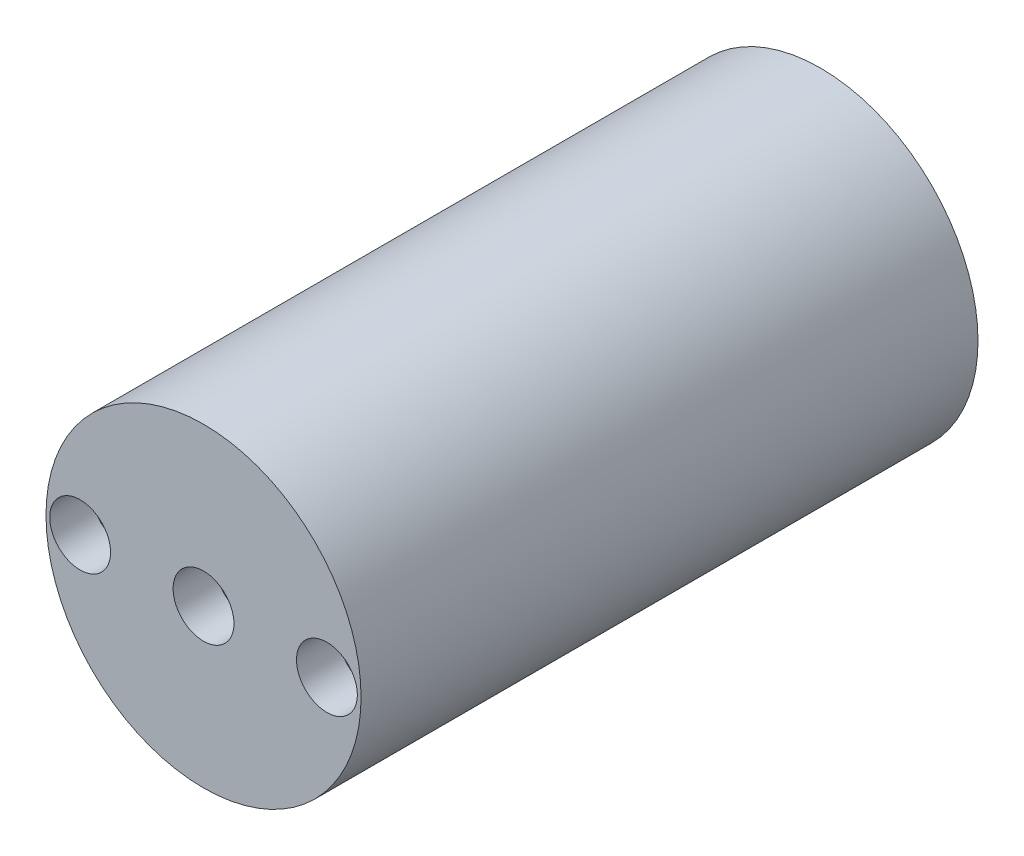
ISO-10303-21;
HEADER;
FILE_DESCRIPTION(('STEP AP214'),'2;1');
FILE_NAME('part.step','',(''),(''),'','','');
FILE_SCHEMA(('AUTOMOTIVE_DESIGN { 1 0 10303 214 1 1 1 1 }'));
ENDSEC;
DATA;
#1=APPLICATION_CONTEXT('core data for automotive mechanical design processes');
#2=APPLICATION_PROTOCOL_DEFINITION('international standard','automotive_design',2000,#1);
#3=PRODUCT_CONTEXT('',#1,'mechanical');
#4=PRODUCT('Part','Part','',(#3));
#5=PRODUCT_RELATED_PRODUCT_CATEGORY('part','',(#4));
#6=PRODUCT_DEFINITION_FORMATION('','',#4);
#7=PRODUCT_DEFINITION_CONTEXT('part definition',#1,'design');
#8=PRODUCT_DEFINITION('design','',#6,#7);
#9=PRODUCT_DEFINITION_SHAPE('','',#8);
#10=(LENGTH_UNIT() NAMED_UNIT(*) SI_UNIT(.MILLI.,.METRE.));
#11=(NAMED_UNIT(*) PLANE_ANGLE_UNIT() SI_UNIT($,.RADIAN.));
#12=(NAMED_UNIT(*) SI_UNIT($,.STERADIAN.) SOLID_ANGLE_UNIT());
#13=UNCERTAINTY_MEASURE_WITH_UNIT(LENGTH_MEASURE(1.E-05),#10,'distance_accuracy_value','');
#14=(GEOMETRIC_REPRESENTATION_CONTEXT(3) GLOBAL_UNCERTAINTY_ASSIGNED_CONTEXT((#13)) GLOBAL_UNIT_ASSIGNED_CONTEXT((#10,
#11,#12)) REPRESENTATION_CONTEXT('',''));
#15=CARTESIAN_POINT('',(0.,0.,0.));
#16=DIRECTION('',(0.,0.,1.));
#17=DIRECTION('',(1.,0.,0.));
#18=AXIS2_PLACEMENT_3D('',#15,#16,#17);
#19=CARTESIAN_POINT('',(0.,0.,75.));
#20=DIRECTION('',(0.,0.,-1.));
#21=DIRECTION('',(-1.,0.,0.));
#22=AXIS2_PLACEMENT_3D('',#19,#20,#21);
#23=CYLINDRICAL_SURFACE('',#22,19.15);
#24=CARTESIAN_POINT('',(0.,0.,75.));
#25=DIRECTION('',(0.,0.,1.));
#26=DIRECTION('',(1.,0.,0.));
#27=AXIS2_PLACEMENT_3D('',#24,#25,#26);
#28=CIRCLE('',#27,19.15);
#29=CARTESIAN_POINT('',(19.15,0.,75.));
#30=VERTEX_POINT('',#29);
#31=EDGE_CURVE('E10',#30,#30,#28,.T.);
#32=ORIENTED_EDGE('',*,*,#31,.F.);
#33=EDGE_LOOP('',(#32));
#34=FACE_BOUND('',#33,.T.);
#35=CARTESIAN_POINT('',(0.,0.,0.));
#36=DIRECTION('',(0.,0.,1.));
#37=DIRECTION('',(1.,0.,0.));
#38=AXIS2_PLACEMENT_3D('',#35,#36,#37);
#39=CIRCLE('',#38,19.15);
#40=CARTESIAN_POINT('',(19.15,0.,0.));
#41=VERTEX_POINT('',#40);
#42=EDGE_CURVE('E34',#41,#41,#39,.T.);
#43=ORIENTED_EDGE('',*,*,#42,.T.);
#44=EDGE_LOOP('',(#43));
#45=FACE_BOUND('',#44,.T.);
#46=ADVANCED_FACE('F31',(#34,#45),#23,.T.);
#47=CARTESIAN_POINT('',(0.,0.,75.));
#48=DIRECTION('',(0.,0.,1.));
#49=DIRECTION('',(1.,0.,0.));
#50=AXIS2_PLACEMENT_3D('',#47,#48,#49);
#51=PLANE('',#50);
#52=CARTESIAN_POINT('',(15.,0.,75.));
#53=DIRECTION('',(0.,0.,1.));
#54=DIRECTION('',(1.,0.,0.));
#55=AXIS2_PLACEMENT_3D('',#52,#53,#54);
#56=CIRCLE('',#55,3.7);
#57=CARTESIAN_POINT('',(18.7,0.,75.));
#58=VERTEX_POINT('',#57);
#59=EDGE_CURVE('E49',#58,#58,#56,.T.);
#60=ORIENTED_EDGE('',*,*,#59,.F.);
#61=EDGE_LOOP('',(#60));
#62=FACE_BOUND('',#61,.T.);
#63=CARTESIAN_POINT('',(-15.,0.,75.));
#64=DIRECTION('',(0.,0.,1.));
#65=DIRECTION('',(1.,0.,0.));
#66=AXIS2_PLACEMENT_3D('',#63,#64,#65);
#67=CIRCLE('',#66,3.7);
#68=CARTESIAN_POINT('',(-11.3,0.,75.));
#69=VERTEX_POINT('',#68);
#70=EDGE_CURVE('E55',#69,#69,#67,.T.);
#71=ORIENTED_EDGE('',*,*,#70,.F.);
#72=EDGE_LOOP('',(#71));
#73=FACE_BOUND('',#72,.T.);
#74=CARTESIAN_POINT('',(0.,0.,75.));
#75=DIRECTION('',(0.,0.,1.));
#76=DIRECTION('',(1.,0.,0.));
#77=AXIS2_PLACEMENT_3D('',#74,#75,#76);
#78=CIRCLE('',#77,3.7);
#79=CARTESIAN_POINT('',(3.7,0.,75.));
#80=VERTEX_POINT('',#79);
#81=EDGE_CURVE('E43',#80,#80,#78,.T.);
#82=ORIENTED_EDGE('',*,*,#81,.F.);
#83=EDGE_LOOP('',(#82));
#84=FACE_BOUND('',#83,.T.);
#85=ORIENTED_EDGE('',*,*,#31,.T.);
#86=EDGE_LOOP('',(#85));
#87=FACE_BOUND('',#86,.T.);
#88=ADVANCED_FACE('F70',(#62,#73,#84,#87),#51,.T.);
#89=CARTESIAN_POINT('',(0.,0.,0.));
#90=DIRECTION('',(0.,0.,1.));
#91=DIRECTION('',(1.,0.,0.));
#92=AXIS2_PLACEMENT_3D('',#89,#90,#91);
#93=PLANE('',#92);
#94=ORIENTED_EDGE('',*,*,#42,.F.);
#95=EDGE_LOOP('',(#94));
#96=FACE_BOUND('',#95,.T.);
#97=ADVANCED_FACE('F73',(#96),#93,.F.);
#98=CARTESIAN_POINT('',(0.,0.,69.85));
#99=DIRECTION('',(0.,0.,1.));
#100=DIRECTION('',(1.,0.,0.));
#101=AXIS2_PLACEMENT_3D('',#98,#99,#100);
#102=CYLINDRICAL_SURFACE('',#101,3.7);
#103=CARTESIAN_POINT('',(0.,0.,69.85));
#104=DIRECTION('',(0.,0.,1.));
#105=DIRECTION('',(1.,0.,0.));
#106=AXIS2_PLACEMENT_3D('',#103,#104,#105);
#107=CIRCLE('',#106,3.7);
#108=CARTESIAN_POINT('',(3.7,0.,69.85));
#109=VERTEX_POINT('',#108);
#110=EDGE_CURVE('E41',#109,#109,#107,.T.);
#111=CARTESIAN_POINT('',(3.7,0.,69.85));
#112=CARTESIAN_POINT('',(3.7,0.,69.9036458333333));
#113=CARTESIAN_POINT('',(3.7,0.,69.9572916666667));
#114=CARTESIAN_POINT('',(3.7,0.,70.0645833333333));
#115=CARTESIAN_POINT('',(3.7,0.,70.1182291666667));
#116=CARTESIAN_POINT('',(3.7,0.,70.2255208333333));
#117=CARTESIAN_POINT('',(3.7,0.,70.2791666666667));
#118=CARTESIAN_POINT('',(3.7,0.,70.3864583333333));
#119=CARTESIAN_POINT('',(3.7,0.,70.4401041666667));
#120=CARTESIAN_POINT('',(3.7,0.,70.5473958333333));
#121=CARTESIAN_POINT('',(3.7,0.,70.6010416666667));
#122=CARTESIAN_POINT('',(3.7,0.,70.7083333333333));
#123=CARTESIAN_POINT('',(3.7,0.,70.7619791666666));
#124=CARTESIAN_POINT('',(3.7,0.,70.8692708333333));
#125=CARTESIAN_POINT('',(3.7,0.,70.9229166666667));
#126=CARTESIAN_POINT('',(3.7,0.,71.0302083333333));
#127=CARTESIAN_POINT('',(3.7,0.,71.0838541666667));
#128=CARTESIAN_POINT('',(3.7,0.,71.1911458333333));
#129=CARTESIAN_POINT('',(3.7,0.,71.2447916666667));
#130=CARTESIAN_POINT('',(3.7,0.,71.3520833333333));
#131=CARTESIAN_POINT('',(3.7,0.,71.4057291666667));
#132=CARTESIAN_POINT('',(3.7,0.,71.5130208333333));
#133=CARTESIAN_POINT('',(3.7,0.,71.5666666666666));
#134=CARTESIAN_POINT('',(3.7,0.,71.6739583333333));
#135=CARTESIAN_POINT('',(3.7,0.,71.7276041666667));
#136=CARTESIAN_POINT('',(3.7,0.,71.8348958333333));
#137=CARTESIAN_POINT('',(3.7,0.,71.8885416666667));
#138=CARTESIAN_POINT('',(3.7,0.,71.9958333333333));
#139=CARTESIAN_POINT('',(3.7,0.,72.0494791666667));
#140=CARTESIAN_POINT('',(3.7,0.,72.1567708333333));
#141=CARTESIAN_POINT('',(3.7,0.,72.2104166666666));
#142=CARTESIAN_POINT('',(3.7,0.,72.3177083333333));
#143=CARTESIAN_POINT('',(3.7,0.,72.3713541666666));
#144=CARTESIAN_POINT('',(3.7,0.,72.4786458333333));
#145=CARTESIAN_POINT('',(3.7,0.,72.5322916666667));
#146=CARTESIAN_POINT('',(3.7,0.,72.6395833333333));
#147=CARTESIAN_POINT('',(3.7,0.,72.6932291666667));
#148=CARTESIAN_POINT('',(3.7,0.,72.8005208333333));
#149=CARTESIAN_POINT('',(3.7,0.,72.8541666666667));
#150=CARTESIAN_POINT('',(3.7,0.,72.9614583333333));
#151=CARTESIAN_POINT('',(3.7,0.,73.0151041666666));
#152=CARTESIAN_POINT('',(3.7,0.,73.1223958333333));
#153=CARTESIAN_POINT('',(3.7,0.,73.1760416666666));
#154=CARTESIAN_POINT('',(3.7,0.,73.2833333333333));
#155=CARTESIAN_POINT('',(3.7,0.,73.3369791666667));
#156=CARTESIAN_POINT('',(3.7,0.,73.4442708333333));
#157=CARTESIAN_POINT('',(3.7,0.,73.4979166666667));
#158=CARTESIAN_POINT('',(3.7,0.,73.6052083333333));
#159=CARTESIAN_POINT('',(3.7,0.,73.6588541666666));
#160=CARTESIAN_POINT('',(3.7,0.,73.7661458333333));
#161=CARTESIAN_POINT('',(3.7,0.,73.8197916666666));
#162=CARTESIAN_POINT('',(3.7,0.,73.9270833333333));
#163=CARTESIAN_POINT('',(3.7,0.,73.9807291666666));
#164=CARTESIAN_POINT('',(3.7,0.,74.0880208333333));
#165=CARTESIAN_POINT('',(3.7,0.,74.1416666666667));
#166=CARTESIAN_POINT('',(3.7,0.,74.2489583333333));
#167=CARTESIAN_POINT('',(3.7,0.,74.3026041666666));
#168=CARTESIAN_POINT('',(3.7,0.,74.4098958333333));
#169=CARTESIAN_POINT('',(3.7,0.,74.4635416666666));
#170=CARTESIAN_POINT('',(3.7,0.,74.5708333333333));
#171=CARTESIAN_POINT('',(3.7,0.,74.6244791666666));
#172=CARTESIAN_POINT('',(3.7,0.,74.7317708333333));
#173=CARTESIAN_POINT('',(3.7,0.,74.7854166666667));
#174=CARTESIAN_POINT('',(3.7,0.,74.8927083333333));
#175=CARTESIAN_POINT('',(3.7,0.,74.9463541666667));
#176=CARTESIAN_POINT('',(3.7,0.,75.));
#177=B_SPLINE_CURVE_WITH_KNOTS('',3,(#111,#112,#113,#114,#115,#116,#117,#118,#119,#120,#121,
#122,#123,#124,#125,#126,#127,#128,#129,#130,#131,#132,#133,#134,#135,#136,#137,#138,#139,#140,
#141,#142,#143,#144,#145,#146,#147,#148,#149,#150,#151,#152,#153,#154,#155,#156,#157,#158,#159,
#160,#161,#162,#163,#164,#165,#166,#167,#168,#169,#170,#171,#172,#173,#174,#175,#176),
.UNSPECIFIED.,.F.,.F.,(4,2,2,2,2,2,2,2,2,2,2,2,2,2,2,2,2,2,2,2,2,2,2,2,2,2,2,2,2,2,2,2,4),(0.,
0.160937500000014,0.321875000000013,0.482812500000013,0.643750000000012,0.804687500000012,
0.965625000000012,1.12656250000001,1.28750000000001,1.44843750000001,1.60937500000001,
1.77031250000001,1.93125000000001,2.09218750000001,2.25312500000001,2.41406250000001,
2.57500000000001,2.73593750000001,2.89687500000001,3.05781250000001,3.21875000000001,
3.37968750000001,3.54062500000001,3.7015625,3.8625,4.0234375,4.184375,4.3453125,4.50625,
4.6671875,4.828125,4.98906250000002,5.15000000000002),.UNSPECIFIED.);
#178=EDGE_CURVE('BSEAM78',#109,#80,#177,.T.);
#179=ORIENTED_EDGE('',*,*,#110,.F.);
#180=ORIENTED_EDGE('',*,*,#81,.T.);
#181=ORIENTED_EDGE('',*,*,#178,.T.);
#182=ORIENTED_EDGE('',*,*,#178,.F.);
#183=EDGE_LOOP('',(#179,#181,#180,#182));
#184=FACE_BOUND('',#183,.T.);
#185=ADVANCED_FACE('F78',(#184),#102,.F.);
#186=CARTESIAN_POINT('',(0.,0.,69.85));
#187=DIRECTION('',(0.,0.,1.));
#188=DIRECTION('',(1.,0.,0.));
#189=AXIS2_PLACEMENT_3D('',#186,#187,#188);
#190=PLANE('',#189);
#191=ORIENTED_EDGE('',*,*,#110,.T.);
#192=EDGE_LOOP('',(#191));
#193=FACE_BOUND('',#192,.T.);
#194=ADVANCED_FACE('F66',(#193),#190,.T.);
#195=CARTESIAN_POINT('',(-15.,0.,69.85));
#196=DIRECTION('',(0.,0.,1.));
#197=DIRECTION('',(1.,0.,0.));
#198=AXIS2_PLACEMENT_3D('',#195,#196,#197);
#199=CYLINDRICAL_SURFACE('',#198,3.7);
#200=CARTESIAN_POINT('',(-15.,0.,69.85));
#201=DIRECTION('',(0.,0.,1.));
#202=DIRECTION('',(1.,0.,0.));
#203=AXIS2_PLACEMENT_3D('',#200,#201,#202);
#204=CIRCLE('',#203,3.7);
#205=CARTESIAN_POINT('',(-11.3,0.,69.85));
#206=VERTEX_POINT('',#205);
#207=EDGE_CURVE('E46',#206,#206,#204,.T.);
#208=CARTESIAN_POINT('',(-11.3,0.,69.85));
#209=CARTESIAN_POINT('',(-11.3,0.,69.9036458333333));
#210=CARTESIAN_POINT('',(-11.3,0.,69.9572916666667));
#211=CARTESIAN_POINT('',(-11.3,0.,70.0645833333333));
#212=CARTESIAN_POINT('',(-11.3,0.,70.1182291666667));
#213=CARTESIAN_POINT('',(-11.3,0.,70.2255208333333));
#214=CARTESIAN_POINT('',(-11.3,0.,70.2791666666667));
#215=CARTESIAN_POINT('',(-11.3,0.,70.3864583333333));
#216=CARTESIAN_POINT('',(-11.3,0.,70.4401041666667));
#217=CARTESIAN_POINT('',(-11.3,0.,70.5473958333333));
#218=CARTESIAN_POINT('',(-11.3,0.,70.6010416666667));
#219=CARTESIAN_POINT('',(-11.3,0.,70.7083333333333));
#220=CARTESIAN_POINT('',(-11.3,0.,70.7619791666666));
#221=CARTESIAN_POINT('',(-11.3,0.,70.8692708333333));
#222=CARTESIAN_POINT('',(-11.3,0.,70.9229166666667));
#223=CARTESIAN_POINT('',(-11.3,0.,71.0302083333333));
#224=CARTESIAN_POINT('',(-11.3,0.,71.0838541666667));
#225=CARTESIAN_POINT('',(-11.3,0.,71.1911458333333));
#226=CARTESIAN_POINT('',(-11.3,0.,71.2447916666667));
#227=CARTESIAN_POINT('',(-11.3,0.,71.3520833333333));
#228=CARTESIAN_POINT('',(-11.3,0.,71.4057291666667));
#229=CARTESIAN_POINT('',(-11.3,0.,71.5130208333333));
#230=CARTESIAN_POINT('',(-11.3,0.,71.5666666666666));
#231=CARTESIAN_POINT('',(-11.3,0.,71.6739583333333));
#232=CARTESIAN_POINT('',(-11.3,0.,71.7276041666667));
#233=CARTESIAN_POINT('',(-11.3,0.,71.8348958333333));
#234=CARTESIAN_POINT('',(-11.3,0.,71.8885416666667));
#235=CARTESIAN_POINT('',(-11.3,0.,71.9958333333333));
#236=CARTESIAN_POINT('',(-11.3,0.,72.0494791666667));
#237=CARTESIAN_POINT('',(-11.3,0.,72.1567708333333));
#238=CARTESIAN_POINT('',(-11.3,0.,72.2104166666666));
#239=CARTESIAN_POINT('',(-11.3,0.,72.3177083333333));
#240=CARTESIAN_POINT('',(-11.3,0.,72.3713541666666));
#241=CARTESIAN_POINT('',(-11.3,0.,72.4786458333333));
#242=CARTESIAN_POINT('',(-11.3,0.,72.5322916666667));
#243=CARTESIAN_POINT('',(-11.3,0.,72.6395833333333));
#244=CARTESIAN_POINT('',(-11.3,0.,72.6932291666667));
#245=CARTESIAN_POINT('',(-11.3,0.,72.8005208333333));
#246=CARTESIAN_POINT('',(-11.3,0.,72.8541666666667));
#247=CARTESIAN_POINT('',(-11.3,0.,72.9614583333333));
#248=CARTESIAN_POINT('',(-11.3,0.,73.0151041666666));
#249=CARTESIAN_POINT('',(-11.3,0.,73.1223958333333));
#250=CARTESIAN_POINT('',(-11.3,0.,73.1760416666666));
#251=CARTESIAN_POINT('',(-11.3,0.,73.2833333333333));
#252=CARTESIAN_POINT('',(-11.3,0.,73.3369791666667));
#253=CARTESIAN_POINT('',(-11.3,0.,73.4442708333333));
#254=CARTESIAN_POINT('',(-11.3,0.,73.4979166666667));
#255=CARTESIAN_POINT('',(-11.3,0.,73.6052083333333));
#256=CARTESIAN_POINT('',(-11.3,0.,73.6588541666666));
#257=CARTESIAN_POINT('',(-11.3,0.,73.7661458333333));
#258=CARTESIAN_POINT('',(-11.3,0.,73.8197916666666));
#259=CARTESIAN_POINT('',(-11.3,0.,73.9270833333333));
#260=CARTESIAN_POINT('',(-11.3,0.,73.9807291666666));
#261=CARTESIAN_POINT('',(-11.3,0.,74.0880208333333));
#262=CARTESIAN_POINT('',(-11.3,0.,74.1416666666667));
#263=CARTESIAN_POINT('',(-11.3,0.,74.2489583333333));
#264=CARTESIAN_POINT('',(-11.3,0.,74.3026041666666));
#265=CARTESIAN_POINT('',(-11.3,0.,74.4098958333333));
#266=CARTESIAN_POINT('',(-11.3,0.,74.4635416666666));
#267=CARTESIAN_POINT('',(-11.3,0.,74.5708333333333));
#268=CARTESIAN_POINT('',(-11.3,0.,74.6244791666666));
#269=CARTESIAN_POINT('',(-11.3,0.,74.7317708333333));
#270=CARTESIAN_POINT('',(-11.3,0.,74.7854166666667));
#271=CARTESIAN_POINT('',(-11.3,0.,74.8927083333333));
#272=CARTESIAN_POINT('',(-11.3,0.,74.9463541666667));
#273=CARTESIAN_POINT('',(-11.3,0.,75.));
#274=B_SPLINE_CURVE_WITH_KNOTS('',3,(#208,#209,#210,#211,#212,#213,#214,#215,#216,#217,#218,
#219,#220,#221,#222,#223,#224,#225,#226,#227,#228,#229,#230,#231,#232,#233,#234,#235,#236,#237,
#238,#239,#240,#241,#242,#243,#244,#245,#246,#247,#248,#249,#250,#251,#252,#253,#254,#255,#256,
#257,#258,#259,#260,#261,#262,#263,#264,#265,#266,#267,#268,#269,#270,#271,#272,#273),
.UNSPECIFIED.,.F.,.F.,(4,2,2,2,2,2,2,2,2,2,2,2,2,2,2,2,2,2,2,2,2,2,2,2,2,2,2,2,2,2,2,2,4),(0.,
0.160937500000014,0.321875000000013,0.482812500000013,0.643750000000012,0.804687500000012,
0.965625000000012,1.12656250000001,1.28750000000001,1.44843750000001,1.60937500000001,
1.77031250000001,1.93125000000001,2.09218750000001,2.25312500000001,2.41406250000001,
2.57500000000001,2.73593750000001,2.89687500000001,3.05781250000001,3.21875000000001,
3.37968750000001,3.54062500000001,3.7015625,3.8625,4.0234375,4.184375,4.3453125,4.50625,
4.6671875,4.828125,4.98906250000002,5.15000000000002),.UNSPECIFIED.);
#275=EDGE_CURVE('BSEAM63',#206,#69,#274,.T.);
#276=ORIENTED_EDGE('',*,*,#207,.F.);
#277=ORIENTED_EDGE('',*,*,#70,.T.);
#278=ORIENTED_EDGE('',*,*,#275,.T.);
#279=ORIENTED_EDGE('',*,*,#275,.F.);
#280=EDGE_LOOP('',(#276,#278,#277,#279));
#281=FACE_BOUND('',#280,.T.);
#282=ADVANCED_FACE('F63',(#281),#199,.F.);
#283=CARTESIAN_POINT('',(-15.,0.,69.85));
#284=DIRECTION('',(0.,0.,1.));
#285=DIRECTION('',(1.,0.,0.));
#286=AXIS2_PLACEMENT_3D('',#283,#284,#285);
#287=PLANE('',#286);
#288=ORIENTED_EDGE('',*,*,#207,.T.);
#289=EDGE_LOOP('',(#288));
#290=FACE_BOUND('',#289,.T.);
#291=ADVANCED_FACE('F61',(#290),#287,.T.);
#292=CARTESIAN_POINT('',(15.,0.,69.85));
#293=DIRECTION('',(0.,0.,1.));
#294=DIRECTION('',(1.,0.,0.));
#295=AXIS2_PLACEMENT_3D('',#292,#293,#294);
#296=CYLINDRICAL_SURFACE('',#295,3.7);
#297=CARTESIAN_POINT('',(15.,0.,69.85));
#298=DIRECTION('',(0.,0.,1.));
#299=DIRECTION('',(1.,0.,0.));
#300=AXIS2_PLACEMENT_3D('',#297,#298,#299);
#301=CIRCLE('',#300,3.7);
#302=CARTESIAN_POINT('',(18.7,0.,69.85));
#303=VERTEX_POINT('',#302);
#304=EDGE_CURVE('E52',#303,#303,#301,.T.);
#305=CARTESIAN_POINT('',(18.7,0.,69.85));
#306=CARTESIAN_POINT('',(18.7,0.,69.9036458333333));
#307=CARTESIAN_POINT('',(18.7,0.,69.9572916666667));
#308=CARTESIAN_POINT('',(18.7,0.,70.0645833333333));
#309=CARTESIAN_POINT('',(18.7,0.,70.1182291666667));
#310=CARTESIAN_POINT('',(18.7,0.,70.2255208333333));
#311=CARTESIAN_POINT('',(18.7,0.,70.2791666666667));
#312=CARTESIAN_POINT('',(18.7,0.,70.3864583333333));
#313=CARTESIAN_POINT('',(18.7,0.,70.4401041666667));
#314=CARTESIAN_POINT('',(18.7,0.,70.5473958333333));
#315=CARTESIAN_POINT('',(18.7,0.,70.6010416666667));
#316=CARTESIAN_POINT('',(18.7,0.,70.7083333333333));
#317=CARTESIAN_POINT('',(18.7,0.,70.7619791666666));
#318=CARTESIAN_POINT('',(18.7,0.,70.8692708333333));
#319=CARTESIAN_POINT('',(18.7,0.,70.9229166666667));
#320=CARTESIAN_POINT('',(18.7,0.,71.0302083333333));
#321=CARTESIAN_POINT('',(18.7,0.,71.0838541666667));
#322=CARTESIAN_POINT('',(18.7,0.,71.1911458333333));
#323=CARTESIAN_POINT('',(18.7,0.,71.2447916666667));
#324=CARTESIAN_POINT('',(18.7,0.,71.3520833333333));
#325=CARTESIAN_POINT('',(18.7,0.,71.4057291666667));
#326=CARTESIAN_POINT('',(18.7,0.,71.5130208333333));
#327=CARTESIAN_POINT('',(18.7,0.,71.5666666666666));
#328=CARTESIAN_POINT('',(18.7,0.,71.6739583333333));
#329=CARTESIAN_POINT('',(18.7,0.,71.7276041666667));
#330=CARTESIAN_POINT('',(18.7,0.,71.8348958333333));
#331=CARTESIAN_POINT('',(18.7,0.,71.8885416666667));
#332=CARTESIAN_POINT('',(18.7,0.,71.9958333333333));
#333=CARTESIAN_POINT('',(18.7,0.,72.0494791666667));
#334=CARTESIAN_POINT('',(18.7,0.,72.1567708333333));
#335=CARTESIAN_POINT('',(18.7,0.,72.2104166666666));
#336=CARTESIAN_POINT('',(18.7,0.,72.3177083333333));
#337=CARTESIAN_POINT('',(18.7,0.,72.3713541666666));
#338=CARTESIAN_POINT('',(18.7,0.,72.4786458333333));
#339=CARTESIAN_POINT('',(18.7,0.,72.5322916666667));
#340=CARTESIAN_POINT('',(18.7,0.,72.6395833333333));
#341=CARTESIAN_POINT('',(18.7,0.,72.6932291666667));
#342=CARTESIAN_POINT('',(18.7,0.,72.8005208333333));
#343=CARTESIAN_POINT('',(18.7,0.,72.8541666666667));
#344=CARTESIAN_POINT('',(18.7,0.,72.9614583333333));
#345=CARTESIAN_POINT('',(18.7,0.,73.0151041666666));
#346=CARTESIAN_POINT('',(18.7,0.,73.1223958333333));
#347=CARTESIAN_POINT('',(18.7,0.,73.1760416666666));
#348=CARTESIAN_POINT('',(18.7,0.,73.2833333333333));
#349=CARTESIAN_POINT('',(18.7,0.,73.3369791666667));
#350=CARTESIAN_POINT('',(18.7,0.,73.4442708333333));
#351=CARTESIAN_POINT('',(18.7,0.,73.4979166666667));
#352=CARTESIAN_POINT('',(18.7,0.,73.6052083333333));
#353=CARTESIAN_POINT('',(18.7,0.,73.6588541666666));
#354=CARTESIAN_POINT('',(18.7,0.,73.7661458333333));
#355=CARTESIAN_POINT('',(18.7,0.,73.8197916666666));
#356=CARTESIAN_POINT('',(18.7,0.,73.9270833333333));
#357=CARTESIAN_POINT('',(18.7,0.,73.9807291666666));
#358=CARTESIAN_POINT('',(18.7,0.,74.0880208333333));
#359=CARTESIAN_POINT('',(18.7,0.,74.1416666666667));
#360=CARTESIAN_POINT('',(18.7,0.,74.2489583333333));
#361=CARTESIAN_POINT('',(18.7,0.,74.3026041666666));
#362=CARTESIAN_POINT('',(18.7,0.,74.4098958333333));
#363=CARTESIAN_POINT('',(18.7,0.,74.4635416666666));
#364=CARTESIAN_POINT('',(18.7,0.,74.5708333333333));
#365=CARTESIAN_POINT('',(18.7,0.,74.6244791666666));
#366=CARTESIAN_POINT('',(18.7,0.,74.7317708333333));
#367=CARTESIAN_POINT('',(18.7,0.,74.7854166666667));
#368=CARTESIAN_POINT('',(18.7,0.,74.8927083333333));
#369=CARTESIAN_POINT('',(18.7,0.,74.9463541666667));
#370=CARTESIAN_POINT('',(18.7,0.,75.));
#371=B_SPLINE_CURVE_WITH_KNOTS('',3,(#305,#306,#307,#308,#309,#310,#311,#312,#313,#314,#315,
#316,#317,#318,#319,#320,#321,#322,#323,#324,#325,#326,#327,#328,#329,#330,#331,#332,#333,#334,
#335,#336,#337,#338,#339,#340,#341,#342,#343,#344,#345,#346,#347,#348,#349,#350,#351,#352,#353,
#354,#355,#356,#357,#358,#359,#360,#361,#362,#363,#364,#365,#366,#367,#368,#369,#370),
.UNSPECIFIED.,.F.,.F.,(4,2,2,2,2,2,2,2,2,2,2,2,2,2,2,2,2,2,2,2,2,2,2,2,2,2,2,2,2,2,2,2,4),(0.,
0.160937500000014,0.321875000000013,0.482812500000013,0.643750000000012,0.804687500000012,
0.965625000000012,1.12656250000001,1.28750000000001,1.44843750000001,1.60937500000001,
1.77031250000001,1.93125000000001,2.09218750000001,2.25312500000001,2.41406250000001,
2.57500000000001,2.73593750000001,2.89687500000001,3.05781250000001,3.21875000000001,
3.37968750000001,3.54062500000001,3.7015625,3.8625,4.0234375,4.184375,4.3453125,4.50625,
4.6671875,4.828125,4.98906250000002,5.15000000000002),.UNSPECIFIED.);
#372=EDGE_CURVE('BSEAM130',#303,#58,#371,.T.);
#373=ORIENTED_EDGE('',*,*,#304,.F.);
#374=ORIENTED_EDGE('',*,*,#59,.T.);
#375=ORIENTED_EDGE('',*,*,#372,.T.);
#376=ORIENTED_EDGE('',*,*,#372,.F.);
#377=EDGE_LOOP('',(#373,#375,#374,#376));
#378=FACE_BOUND('',#377,.T.);
#379=ADVANCED_FACE('F130',(#378),#296,.F.);
#380=CARTESIAN_POINT('',(15.,0.,69.85));
#381=DIRECTION('',(0.,0.,1.));
#382=DIRECTION('',(1.,0.,0.));
#383=AXIS2_PLACEMENT_3D('',#380,#381,#382);
#384=PLANE('',#383);
#385=ORIENTED_EDGE('',*,*,#304,.T.);
#386=EDGE_LOOP('',(#385));
#387=FACE_BOUND('',#386,.T.);
#388=ADVANCED_FACE('F138',(#387),#384,.T.);
#389=CLOSED_SHELL('',(#46,#88,#97,#185,#194,#282,#291,#379,#388));
#390=MANIFOLD_SOLID_BREP('B2',#389);
#391=ADVANCED_BREP_SHAPE_REPRESENTATION('',(#18,#390),#14);
#392=SHAPE_DEFINITION_REPRESENTATION(#9,#391);
ENDSEC;
END-ISO-10303-21;
